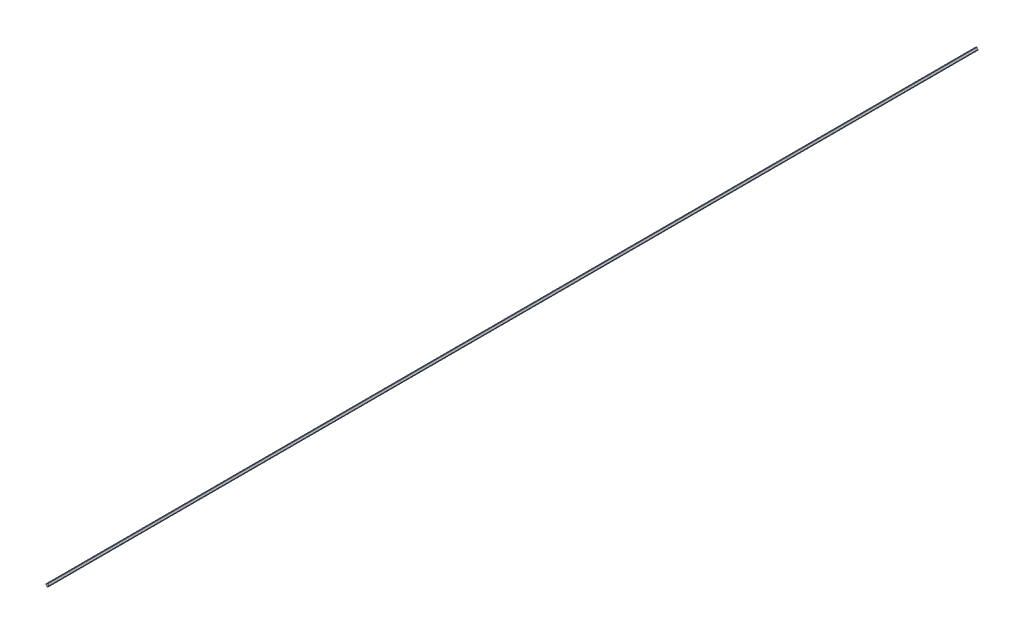
ISO-10303-21;
HEADER;
FILE_DESCRIPTION(('STEP AP214'),'2;1');
FILE_NAME('part.step','',(''),(''),'','','');
FILE_SCHEMA(('AUTOMOTIVE_DESIGN { 1 0 10303 214 1 1 1 1 }'));
ENDSEC;
DATA;
#1=APPLICATION_CONTEXT('core data for automotive mechanical design processes');
#2=APPLICATION_PROTOCOL_DEFINITION('international standard','automotive_design',2000,#1);
#3=PRODUCT_CONTEXT('',#1,'mechanical');
#4=PRODUCT('Part','Part','',(#3));
#5=PRODUCT_RELATED_PRODUCT_CATEGORY('part','',(#4));
#6=PRODUCT_DEFINITION_FORMATION('','',#4);
#7=PRODUCT_DEFINITION_CONTEXT('part definition',#1,'design');
#8=PRODUCT_DEFINITION('design','',#6,#7);
#9=PRODUCT_DEFINITION_SHAPE('','',#8);
#10=(LENGTH_UNIT() NAMED_UNIT(*) SI_UNIT(.MILLI.,.METRE.));
#11=(NAMED_UNIT(*) PLANE_ANGLE_UNIT() SI_UNIT($,.RADIAN.));
#12=(NAMED_UNIT(*) SI_UNIT($,.STERADIAN.) SOLID_ANGLE_UNIT());
#13=UNCERTAINTY_MEASURE_WITH_UNIT(LENGTH_MEASURE(1.E-05),#10,'distance_accuracy_value','');
#14=(GEOMETRIC_REPRESENTATION_CONTEXT(3) GLOBAL_UNCERTAINTY_ASSIGNED_CONTEXT((#13)) GLOBAL_UNIT_ASSIGNED_CONTEXT((#10,
#11,#12)) REPRESENTATION_CONTEXT('',''));
#15=CARTESIAN_POINT('',(0.,0.,0.));
#16=DIRECTION('',(0.,0.,1.));
#17=DIRECTION('',(1.,0.,0.));
#18=AXIS2_PLACEMENT_3D('',#15,#16,#17);
#19=CARTESIAN_POINT('',(-7.13499999999989,7.135,2089.35));
#20=DIRECTION('',(0.,0.,-1.));
#21=DIRECTION('',(-1.,0.,0.));
#22=AXIS2_PLACEMENT_3D('',#19,#20,#21);
#23=CYLINDRICAL_SURFACE('',#22,5.59);
#24=CARTESIAN_POINT('',(-7.13499999999989,7.135,-2089.35));
#25=DIRECTION('',(0.,0.,-1.));
#26=DIRECTION('',(-1.,0.,0.));
#27=AXIS2_PLACEMENT_3D('',#24,#25,#26);
#28=CIRCLE('',#27,5.59);
#29=CARTESIAN_POINT('',(-1.54499999999989,7.135,-2089.35));
#30=VERTEX_POINT('',#29);
#31=CARTESIAN_POINT('',(-7.13499999999989,1.545,-2089.35));
#32=VERTEX_POINT('',#31);
#33=EDGE_CURVE('E129',#30,#32,#28,.T.);
#34=ORIENTED_EDGE('',*,*,#33,.T.);
#35=DIRECTION('',(0.,0.,-1.));
#36=VECTOR('',#35,1.);
#37=CARTESIAN_POINT('',(-7.13499999999989,1.545,2089.35));
#38=LINE('',#37,#36);
#39=CARTESIAN_POINT('',(-7.13499999999989,1.545,2089.35));
#40=VERTEX_POINT('',#39);
#41=EDGE_CURVE('E11',#40,#32,#38,.T.);
#42=ORIENTED_EDGE('',*,*,#41,.F.);
#43=CARTESIAN_POINT('',(-7.13499999999989,7.135,2089.35));
#44=DIRECTION('',(0.,0.,-1.));
#45=DIRECTION('',(-1.,0.,0.));
#46=AXIS2_PLACEMENT_3D('',#43,#44,#45);
#47=CIRCLE('',#46,5.59);
#48=CARTESIAN_POINT('',(-1.54499999999989,7.135,2089.35));
#49=VERTEX_POINT('',#48);
#50=EDGE_CURVE('E143',#49,#40,#47,.T.);
#51=ORIENTED_EDGE('',*,*,#50,.F.);
#52=DIRECTION('',(0.,0.,-1.));
#53=VECTOR('',#52,1.);
#54=CARTESIAN_POINT('',(-1.54499999999989,7.135,2089.35));
#55=LINE('',#54,#53);
#56=EDGE_CURVE('E125',#49,#30,#55,.T.);
#57=ORIENTED_EDGE('',*,*,#56,.T.);
#58=EDGE_LOOP('',(#34,#42,#51,#57));
#59=FACE_BOUND('',#58,.T.);
#60=ADVANCED_FACE('F33',(#59),#23,.F.);
#61=CARTESIAN_POINT('',(-7.13499999999989,1.545,2089.35));
#62=DIRECTION('',(1.,0.,0.));
#63=DIRECTION('',(0.,0.,-1.));
#64=AXIS2_PLACEMENT_3D('',#61,#62,#63);
#65=PLANE('',#64);
#66=DIRECTION('',(0.,-1.,0.));
#67=VECTOR('',#66,1.);
#68=CARTESIAN_POINT('',(-7.13499999999989,1.545,-2089.35));
#69=LINE('',#68,#67);
#70=CARTESIAN_POINT('',(-7.13499999999989,-1.545,-2089.35));
#71=VERTEX_POINT('',#70);
#72=EDGE_CURVE('E132',#32,#71,#69,.T.);
#73=ORIENTED_EDGE('',*,*,#72,.T.);
#74=DIRECTION('',(0.,0.,-1.));
#75=VECTOR('',#74,1.);
#76=CARTESIAN_POINT('',(-7.13499999999989,-1.545,2089.35));
#77=LINE('',#76,#75);
#78=CARTESIAN_POINT('',(-7.13499999999989,-1.545,2089.35));
#79=VERTEX_POINT('',#78);
#80=EDGE_CURVE('E41',#79,#71,#77,.T.);
#81=ORIENTED_EDGE('',*,*,#80,.F.);
#82=DIRECTION('',(0.,-1.,0.));
#83=VECTOR('',#82,1.);
#84=CARTESIAN_POINT('',(-7.13499999999989,1.545,2089.35));
#85=LINE('',#84,#83);
#86=EDGE_CURVE('E92',#40,#79,#85,.T.);
#87=ORIENTED_EDGE('',*,*,#86,.F.);
#88=ORIENTED_EDGE('',*,*,#41,.T.);
#89=EDGE_LOOP('',(#73,#81,#87,#88));
#90=FACE_BOUND('',#89,.T.);
#91=ADVANCED_FACE('F178',(#90),#65,.F.);
#92=CARTESIAN_POINT('',(-7.13499999999989,-7.135,2089.35));
#93=DIRECTION('',(0.,0.,-1.));
#94=DIRECTION('',(-1.,0.,0.));
#95=AXIS2_PLACEMENT_3D('',#92,#93,#94);
#96=CYLINDRICAL_SURFACE('',#95,5.59);
#97=CARTESIAN_POINT('',(-7.13499999999989,-7.135,-2089.35));
#98=DIRECTION('',(0.,0.,-1.));
#99=DIRECTION('',(1.,0.,0.));
#100=AXIS2_PLACEMENT_3D('',#97,#98,#99);
#101=CIRCLE('',#100,5.59);
#102=CARTESIAN_POINT('',(-1.5449999999999,-7.135,-2089.35));
#103=VERTEX_POINT('',#102);
#104=EDGE_CURVE('E134',#71,#103,#101,.T.);
#105=ORIENTED_EDGE('',*,*,#104,.T.);
#106=DIRECTION('',(0.,0.,-1.));
#107=VECTOR('',#106,1.);
#108=CARTESIAN_POINT('',(-1.5449999999999,-7.135,2089.35));
#109=LINE('',#108,#107);
#110=CARTESIAN_POINT('',(-1.5449999999999,-7.135,2089.35));
#111=VERTEX_POINT('',#110);
#112=EDGE_CURVE('E150',#111,#103,#109,.T.);
#113=ORIENTED_EDGE('',*,*,#112,.F.);
#114=CARTESIAN_POINT('',(-7.13499999999989,-7.135,2089.35));
#115=DIRECTION('',(0.,0.,-1.));
#116=DIRECTION('',(1.,0.,0.));
#117=AXIS2_PLACEMENT_3D('',#114,#115,#116);
#118=CIRCLE('',#117,5.59);
#119=EDGE_CURVE('E158',#79,#111,#118,.T.);
#120=ORIENTED_EDGE('',*,*,#119,.F.);
#121=ORIENTED_EDGE('',*,*,#80,.T.);
#122=EDGE_LOOP('',(#105,#113,#120,#121));
#123=FACE_BOUND('',#122,.T.);
#124=ADVANCED_FACE('F156',(#123),#96,.F.);
#125=CARTESIAN_POINT('',(1.54499999999989,-7.135,2089.35));
#126=DIRECTION('',(0.,1.,0.));
#127=DIRECTION('',(0.,0.,1.));
#128=AXIS2_PLACEMENT_3D('',#125,#126,#127);
#129=PLANE('',#128);
#130=DIRECTION('',(1.,0.,0.));
#131=VECTOR('',#130,1.);
#132=CARTESIAN_POINT('',(1.54499999999989,-7.135,-2089.35));
#133=LINE('',#132,#131);
#134=CARTESIAN_POINT('',(1.54499999999989,-7.135,-2089.35));
#135=VERTEX_POINT('',#134);
#136=EDGE_CURVE('E136',#103,#135,#133,.T.);
#137=ORIENTED_EDGE('',*,*,#136,.T.);
#138=DIRECTION('',(0.,0.,-1.));
#139=VECTOR('',#138,1.);
#140=CARTESIAN_POINT('',(1.54499999999989,-7.135,2089.35));
#141=LINE('',#140,#139);
#142=CARTESIAN_POINT('',(1.54499999999989,-7.135,2089.35));
#143=VERTEX_POINT('',#142);
#144=EDGE_CURVE('E147',#143,#135,#141,.T.);
#145=ORIENTED_EDGE('',*,*,#144,.F.);
#146=DIRECTION('',(1.,0.,0.));
#147=VECTOR('',#146,1.);
#148=CARTESIAN_POINT('',(1.54499999999989,-7.135,2089.35));
#149=LINE('',#148,#147);
#150=EDGE_CURVE('E170',#111,#143,#149,.T.);
#151=ORIENTED_EDGE('',*,*,#150,.F.);
#152=ORIENTED_EDGE('',*,*,#112,.T.);
#153=EDGE_LOOP('',(#137,#145,#151,#152));
#154=FACE_BOUND('',#153,.T.);
#155=ADVANCED_FACE('F166',(#154),#129,.F.);
#156=CARTESIAN_POINT('',(7.13499999999989,-7.135,2089.35));
#157=DIRECTION('',(0.,0.,-1.));
#158=DIRECTION('',(-1.,0.,0.));
#159=AXIS2_PLACEMENT_3D('',#156,#157,#158);
#160=CYLINDRICAL_SURFACE('',#159,5.59);
#161=CARTESIAN_POINT('',(7.13499999999989,-7.135,-2089.35));
#162=DIRECTION('',(0.,0.,-1.));
#163=DIRECTION('',(-1.,0.,0.));
#164=AXIS2_PLACEMENT_3D('',#161,#162,#163);
#165=CIRCLE('',#164,5.59);
#166=CARTESIAN_POINT('',(7.13499999999988,-1.545,-2089.35));
#167=VERTEX_POINT('',#166);
#168=EDGE_CURVE('E138',#135,#167,#165,.T.);
#169=ORIENTED_EDGE('',*,*,#168,.T.);
#170=DIRECTION('',(0.,0.,-1.));
#171=VECTOR('',#170,1.);
#172=CARTESIAN_POINT('',(7.13499999999988,-1.545,2089.35));
#173=LINE('',#172,#171);
#174=CARTESIAN_POINT('',(7.13499999999988,-1.545,2089.35));
#175=VERTEX_POINT('',#174);
#176=EDGE_CURVE('E120',#175,#167,#173,.T.);
#177=ORIENTED_EDGE('',*,*,#176,.F.);
#178=CARTESIAN_POINT('',(7.13499999999989,-7.135,2089.35));
#179=DIRECTION('',(0.,0.,-1.));
#180=DIRECTION('',(-1.,0.,0.));
#181=AXIS2_PLACEMENT_3D('',#178,#179,#180);
#182=CIRCLE('',#181,5.59);
#183=EDGE_CURVE('E111',#143,#175,#182,.T.);
#184=ORIENTED_EDGE('',*,*,#183,.F.);
#185=ORIENTED_EDGE('',*,*,#144,.T.);
#186=EDGE_LOOP('',(#169,#177,#184,#185));
#187=FACE_BOUND('',#186,.T.);
#188=ADVANCED_FACE('F169',(#187),#160,.F.);
#189=CARTESIAN_POINT('',(7.13499999999989,1.545,2089.35));
#190=DIRECTION('',(-1.,0.,0.));
#191=DIRECTION('',(0.,-1.,0.));
#192=AXIS2_PLACEMENT_3D('',#189,#190,#191);
#193=PLANE('',#192);
#194=DIRECTION('',(0.,1.,0.));
#195=VECTOR('',#194,1.);
#196=CARTESIAN_POINT('',(7.13499999999989,1.545,-2089.35));
#197=LINE('',#196,#195);
#198=CARTESIAN_POINT('',(7.13499999999989,1.545,-2089.35));
#199=VERTEX_POINT('',#198);
#200=EDGE_CURVE('E119',#167,#199,#197,.T.);
#201=ORIENTED_EDGE('',*,*,#200,.T.);
#202=DIRECTION('',(0.,0.,-1.));
#203=VECTOR('',#202,1.);
#204=CARTESIAN_POINT('',(7.13499999999989,1.545,2089.35));
#205=LINE('',#204,#203);
#206=CARTESIAN_POINT('',(7.13499999999989,1.545,2089.35));
#207=VERTEX_POINT('',#206);
#208=EDGE_CURVE('E116',#207,#199,#205,.T.);
#209=ORIENTED_EDGE('',*,*,#208,.F.);
#210=DIRECTION('',(0.,1.,0.));
#211=VECTOR('',#210,1.);
#212=CARTESIAN_POINT('',(7.13499999999989,1.545,2089.35));
#213=LINE('',#212,#211);
#214=EDGE_CURVE('E105',#175,#207,#213,.T.);
#215=ORIENTED_EDGE('',*,*,#214,.F.);
#216=ORIENTED_EDGE('',*,*,#176,.T.);
#217=EDGE_LOOP('',(#201,#209,#215,#216));
#218=FACE_BOUND('',#217,.T.);
#219=ADVANCED_FACE('F117',(#218),#193,.F.);
#220=CARTESIAN_POINT('',(7.13499999999989,7.135,2089.35));
#221=DIRECTION('',(0.,0.,-1.));
#222=DIRECTION('',(-1.,0.,0.));
#223=AXIS2_PLACEMENT_3D('',#220,#221,#222);
#224=CYLINDRICAL_SURFACE('',#223,5.59);
#225=CARTESIAN_POINT('',(7.13499999999989,7.135,-2089.35));
#226=DIRECTION('',(0.,0.,-1.));
#227=DIRECTION('',(1.,0.,0.));
#228=AXIS2_PLACEMENT_3D('',#225,#226,#227);
#229=CIRCLE('',#228,5.59);
#230=CARTESIAN_POINT('',(1.54499999999989,7.135,-2089.35));
#231=VERTEX_POINT('',#230);
#232=EDGE_CURVE('E78',#199,#231,#229,.T.);
#233=ORIENTED_EDGE('',*,*,#232,.T.);
#234=DIRECTION('',(0.,0.,-1.));
#235=VECTOR('',#234,1.);
#236=CARTESIAN_POINT('',(1.54499999999989,7.135,2089.35));
#237=LINE('',#236,#235);
#238=CARTESIAN_POINT('',(1.54499999999989,7.135,2089.35));
#239=VERTEX_POINT('',#238);
#240=EDGE_CURVE('E121',#239,#231,#237,.T.);
#241=ORIENTED_EDGE('',*,*,#240,.F.);
#242=CARTESIAN_POINT('',(7.13499999999989,7.135,2089.35));
#243=DIRECTION('',(0.,0.,-1.));
#244=DIRECTION('',(1.,0.,0.));
#245=AXIS2_PLACEMENT_3D('',#242,#243,#244);
#246=CIRCLE('',#245,5.59);
#247=EDGE_CURVE('E109',#207,#239,#246,.T.);
#248=ORIENTED_EDGE('',*,*,#247,.F.);
#249=ORIENTED_EDGE('',*,*,#208,.T.);
#250=EDGE_LOOP('',(#233,#241,#248,#249));
#251=FACE_BOUND('',#250,.T.);
#252=ADVANCED_FACE('F123',(#251),#224,.F.);
#253=CARTESIAN_POINT('',(1.54499999999989,7.135,2089.35));
#254=DIRECTION('',(0.,-1.,0.));
#255=DIRECTION('',(0.,0.,-1.));
#256=AXIS2_PLACEMENT_3D('',#253,#254,#255);
#257=PLANE('',#256);
#258=DIRECTION('',(-1.,0.,0.));
#259=VECTOR('',#258,1.);
#260=CARTESIAN_POINT('',(1.54499999999989,7.135,-2089.35));
#261=LINE('',#260,#259);
#262=EDGE_CURVE('E84',#231,#30,#261,.T.);
#263=ORIENTED_EDGE('',*,*,#262,.T.);
#264=ORIENTED_EDGE('',*,*,#56,.F.);
#265=DIRECTION('',(-1.,0.,0.));
#266=VECTOR('',#265,1.);
#267=CARTESIAN_POINT('',(1.54499999999989,7.135,2089.35));
#268=LINE('',#267,#266);
#269=EDGE_CURVE('E49',#239,#49,#268,.T.);
#270=ORIENTED_EDGE('',*,*,#269,.F.);
#271=ORIENTED_EDGE('',*,*,#240,.T.);
#272=EDGE_LOOP('',(#263,#264,#270,#271));
#273=FACE_BOUND('',#272,.T.);
#274=ADVANCED_FACE('F194',(#273),#257,.F.);
#275=CARTESIAN_POINT('',(-7.13499999999989,7.135,2089.35));
#276=DIRECTION('',(0.,0.,-1.));
#277=DIRECTION('',(-1.,0.,0.));
#278=AXIS2_PLACEMENT_3D('',#275,#276,#277);
#279=PLANE('',#278);
#280=ORIENTED_EDGE('',*,*,#50,.T.);
#281=ORIENTED_EDGE('',*,*,#86,.T.);
#282=ORIENTED_EDGE('',*,*,#119,.T.);
#283=ORIENTED_EDGE('',*,*,#150,.T.);
#284=ORIENTED_EDGE('',*,*,#183,.T.);
#285=ORIENTED_EDGE('',*,*,#214,.T.);
#286=ORIENTED_EDGE('',*,*,#247,.T.);
#287=ORIENTED_EDGE('',*,*,#269,.T.);
#288=EDGE_LOOP('',(#280,#281,#282,#283,#284,#285,#286,#287));
#289=FACE_BOUND('',#288,.T.);
#290=ADVANCED_FACE('F107',(#289),#279,.F.);
#291=CARTESIAN_POINT('',(-7.13499999999989,7.135,-2089.35));
#292=DIRECTION('',(0.,0.,-1.));
#293=DIRECTION('',(-1.,0.,0.));
#294=AXIS2_PLACEMENT_3D('',#291,#292,#293);
#295=PLANE('',#294);
#296=ORIENTED_EDGE('',*,*,#33,.F.);
#297=ORIENTED_EDGE('',*,*,#262,.F.);
#298=ORIENTED_EDGE('',*,*,#232,.F.);
#299=ORIENTED_EDGE('',*,*,#200,.F.);
#300=ORIENTED_EDGE('',*,*,#168,.F.);
#301=ORIENTED_EDGE('',*,*,#136,.F.);
#302=ORIENTED_EDGE('',*,*,#104,.F.);
#303=ORIENTED_EDGE('',*,*,#72,.F.);
#304=EDGE_LOOP('',(#296,#297,#298,#299,#300,#301,#302,#303));
#305=FACE_BOUND('',#304,.T.);
#306=ADVANCED_FACE('F162',(#305),#295,.T.);
#307=CLOSED_SHELL('',(#60,#91,#124,#155,#188,#219,#252,#274,#290,#306));
#308=MANIFOLD_SOLID_BREP('B2',#307);
#309=ADVANCED_BREP_SHAPE_REPRESENTATION('',(#18,#308),#14);
#310=SHAPE_DEFINITION_REPRESENTATION(#9,#309);
ENDSEC;
END-ISO-10303-21;
